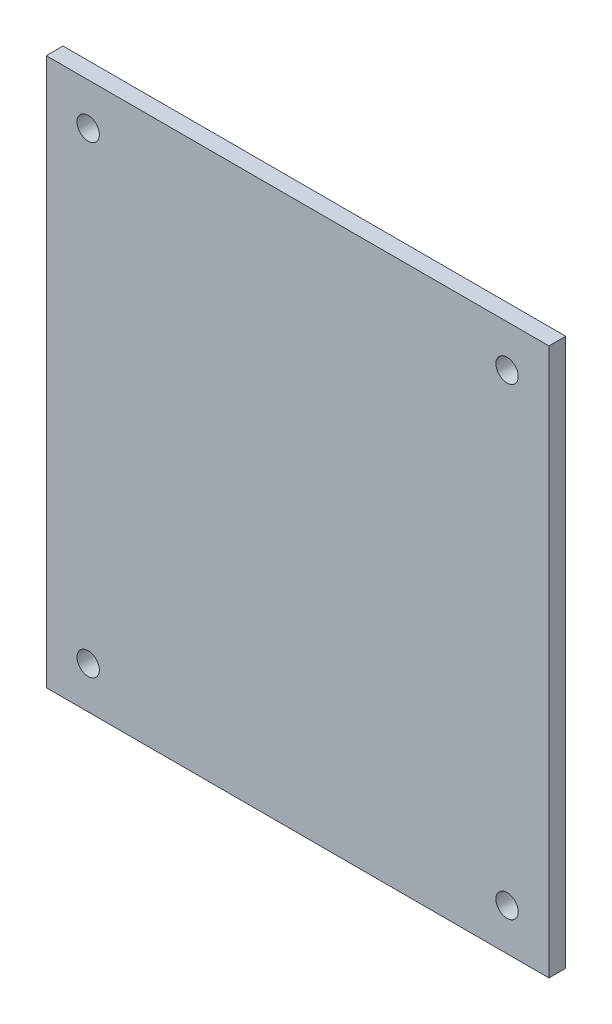
ISO-10303-21;
HEADER;
FILE_DESCRIPTION(('STEP AP214'),'2;1');
FILE_NAME('part.step','',(''),(''),'','','');
FILE_SCHEMA(('AUTOMOTIVE_DESIGN { 1 0 10303 214 1 1 1 1 }'));
ENDSEC;
DATA;
#1=APPLICATION_CONTEXT('core data for automotive mechanical design processes');
#2=APPLICATION_PROTOCOL_DEFINITION('international standard','automotive_design',2000,#1);
#3=PRODUCT_CONTEXT('',#1,'mechanical');
#4=PRODUCT('Part','Part','',(#3));
#5=PRODUCT_RELATED_PRODUCT_CATEGORY('part','',(#4));
#6=PRODUCT_DEFINITION_FORMATION('','',#4);
#7=PRODUCT_DEFINITION_CONTEXT('part definition',#1,'design');
#8=PRODUCT_DEFINITION('design','',#6,#7);
#9=PRODUCT_DEFINITION_SHAPE('','',#8);
#10=(LENGTH_UNIT() NAMED_UNIT(*) SI_UNIT(.MILLI.,.METRE.));
#11=(NAMED_UNIT(*) PLANE_ANGLE_UNIT() SI_UNIT($,.RADIAN.));
#12=(NAMED_UNIT(*) SI_UNIT($,.STERADIAN.) SOLID_ANGLE_UNIT());
#13=UNCERTAINTY_MEASURE_WITH_UNIT(LENGTH_MEASURE(1.E-05),#10,'distance_accuracy_value','');
#14=(GEOMETRIC_REPRESENTATION_CONTEXT(3) GLOBAL_UNCERTAINTY_ASSIGNED_CONTEXT((#13)) GLOBAL_UNIT_ASSIGNED_CONTEXT((#10,
#11,#12)) REPRESENTATION_CONTEXT('',''));
#15=CARTESIAN_POINT('',(0.,0.,0.));
#16=DIRECTION('',(0.,0.,1.));
#17=DIRECTION('',(1.,0.,0.));
#18=AXIS2_PLACEMENT_3D('',#15,#16,#17);
#19=CARTESIAN_POINT('',(-22.5,24.5,1.5));
#20=DIRECTION('',(1.,0.,0.));
#21=DIRECTION('',(0.,1.,0.));
#22=AXIS2_PLACEMENT_3D('',#19,#20,#21);
#23=PLANE('',#22);
#24=DIRECTION('',(0.,-1.,0.));
#25=VECTOR('',#24,1.);
#26=CARTESIAN_POINT('',(-22.5,24.5,0.));
#27=LINE('',#26,#25);
#28=CARTESIAN_POINT('',(-22.5,24.5,0.));
#29=VERTEX_POINT('',#28);
#30=CARTESIAN_POINT('',(-22.5,-24.5,0.));
#31=VERTEX_POINT('',#30);
#32=EDGE_CURVE('E112',#29,#31,#27,.T.);
#33=ORIENTED_EDGE('',*,*,#32,.T.);
#34=DIRECTION('',(0.,0.,-1.));
#35=VECTOR('',#34,1.);
#36=CARTESIAN_POINT('',(-22.5,-24.5,1.5));
#37=LINE('',#36,#35);
#38=CARTESIAN_POINT('',(-22.5,-24.5,1.5));
#39=VERTEX_POINT('',#38);
#40=EDGE_CURVE('E11',#39,#31,#37,.T.);
#41=ORIENTED_EDGE('',*,*,#40,.F.);
#42=DIRECTION('',(0.,-1.,0.));
#43=VECTOR('',#42,1.);
#44=CARTESIAN_POINT('',(-22.5,24.5,1.5));
#45=LINE('',#44,#43);
#46=CARTESIAN_POINT('',(-22.5,24.5,1.5));
#47=VERTEX_POINT('',#46);
#48=EDGE_CURVE('E96',#47,#39,#45,.T.);
#49=ORIENTED_EDGE('',*,*,#48,.F.);
#50=DIRECTION('',(0.,0.,-1.));
#51=VECTOR('',#50,1.);
#52=CARTESIAN_POINT('',(-22.5,24.5,1.5));
#53=LINE('',#52,#51);
#54=EDGE_CURVE('E108',#47,#29,#53,.T.);
#55=ORIENTED_EDGE('',*,*,#54,.T.);
#56=EDGE_LOOP('',(#33,#41,#49,#55));
#57=FACE_BOUND('',#56,.T.);
#58=ADVANCED_FACE('F44',(#57),#23,.F.);
#59=CARTESIAN_POINT('',(22.5,-24.5,1.5));
#60=DIRECTION('',(0.,1.,0.));
#61=DIRECTION('',(-1.,0.,0.));
#62=AXIS2_PLACEMENT_3D('',#59,#60,#61);
#63=PLANE('',#62);
#64=DIRECTION('',(1.,0.,0.));
#65=VECTOR('',#64,1.);
#66=CARTESIAN_POINT('',(22.5,-24.5,0.));
#67=LINE('',#66,#65);
#68=CARTESIAN_POINT('',(22.5,-24.5,0.));
#69=VERTEX_POINT('',#68);
#70=EDGE_CURVE('E101',#31,#69,#67,.T.);
#71=ORIENTED_EDGE('',*,*,#70,.T.);
#72=DIRECTION('',(0.,0.,-1.));
#73=VECTOR('',#72,1.);
#74=CARTESIAN_POINT('',(22.5,-24.5,1.5));
#75=LINE('',#74,#73);
#76=CARTESIAN_POINT('',(22.5,-24.5,1.5));
#77=VERTEX_POINT('',#76);
#78=EDGE_CURVE('E53',#77,#69,#75,.T.);
#79=ORIENTED_EDGE('',*,*,#78,.F.);
#80=DIRECTION('',(1.,0.,0.));
#81=VECTOR('',#80,1.);
#82=CARTESIAN_POINT('',(22.5,-24.5,1.5));
#83=LINE('',#82,#81);
#84=EDGE_CURVE('E91',#39,#77,#83,.T.);
#85=ORIENTED_EDGE('',*,*,#84,.F.);
#86=ORIENTED_EDGE('',*,*,#40,.T.);
#87=EDGE_LOOP('',(#71,#79,#85,#86));
#88=FACE_BOUND('',#87,.T.);
#89=ADVANCED_FACE('F100',(#88),#63,.F.);
#90=CARTESIAN_POINT('',(22.5,24.5,1.5));
#91=DIRECTION('',(-1.,0.,0.));
#92=DIRECTION('',(0.,-1.,0.));
#93=AXIS2_PLACEMENT_3D('',#90,#91,#92);
#94=PLANE('',#93);
#95=DIRECTION('',(0.,1.,0.));
#96=VECTOR('',#95,1.);
#97=CARTESIAN_POINT('',(22.5,24.5,0.));
#98=LINE('',#97,#96);
#99=CARTESIAN_POINT('',(22.5,24.5,0.));
#100=VERTEX_POINT('',#99);
#101=EDGE_CURVE('E78',#69,#100,#98,.T.);
#102=ORIENTED_EDGE('',*,*,#101,.T.);
#103=DIRECTION('',(0.,0.,-1.));
#104=VECTOR('',#103,1.);
#105=CARTESIAN_POINT('',(22.5,24.5,1.5));
#106=LINE('',#105,#104);
#107=CARTESIAN_POINT('',(22.5,24.5,1.5));
#108=VERTEX_POINT('',#107);
#109=EDGE_CURVE('E103',#108,#100,#106,.T.);
#110=ORIENTED_EDGE('',*,*,#109,.F.);
#111=DIRECTION('',(0.,1.,0.));
#112=VECTOR('',#111,1.);
#113=CARTESIAN_POINT('',(22.5,24.5,1.5));
#114=LINE('',#113,#112);
#115=EDGE_CURVE('E94',#77,#108,#114,.T.);
#116=ORIENTED_EDGE('',*,*,#115,.F.);
#117=ORIENTED_EDGE('',*,*,#78,.T.);
#118=EDGE_LOOP('',(#102,#110,#116,#117));
#119=FACE_BOUND('',#118,.T.);
#120=ADVANCED_FACE('F104',(#119),#94,.F.);
#121=CARTESIAN_POINT('',(22.5,24.5,1.5));
#122=DIRECTION('',(0.,-1.,0.));
#123=DIRECTION('',(1.,0.,0.));
#124=AXIS2_PLACEMENT_3D('',#121,#122,#123);
#125=PLANE('',#124);
#126=DIRECTION('',(-1.,0.,0.));
#127=VECTOR('',#126,1.);
#128=CARTESIAN_POINT('',(22.5,24.5,0.));
#129=LINE('',#128,#127);
#130=EDGE_CURVE('E84',#100,#29,#129,.T.);
#131=ORIENTED_EDGE('',*,*,#130,.T.);
#132=ORIENTED_EDGE('',*,*,#54,.F.);
#133=DIRECTION('',(-1.,0.,0.));
#134=VECTOR('',#133,1.);
#135=CARTESIAN_POINT('',(22.5,24.5,1.5));
#136=LINE('',#135,#134);
#137=EDGE_CURVE('E61',#108,#47,#136,.T.);
#138=ORIENTED_EDGE('',*,*,#137,.F.);
#139=ORIENTED_EDGE('',*,*,#109,.T.);
#140=EDGE_LOOP('',(#131,#132,#138,#139));
#141=FACE_BOUND('',#140,.T.);
#142=ADVANCED_FACE('F126',(#141),#125,.F.);
#143=CARTESIAN_POINT('',(0.,0.,1.5));
#144=DIRECTION('',(0.,0.,-1.));
#145=DIRECTION('',(-1.,0.,0.));
#146=AXIS2_PLACEMENT_3D('',#143,#144,#145);
#147=PLANE('',#146);
#148=CARTESIAN_POINT('',(-18.75,-20.75,1.5));
#149=DIRECTION('',(0.,0.,-1.));
#150=DIRECTION('',(-1.,0.,0.));
#151=AXIS2_PLACEMENT_3D('',#148,#149,#150);
#152=CIRCLE('',#151,1.);
#153=CARTESIAN_POINT('',(-19.75,-20.75,1.5));
#154=VERTEX_POINT('',#153);
#155=EDGE_CURVE('E116',#154,#154,#152,.T.);
#156=ORIENTED_EDGE('',*,*,#155,.T.);
#157=EDGE_LOOP('',(#156));
#158=FACE_BOUND('',#157,.T.);
#159=CARTESIAN_POINT('',(18.75,-20.75,1.5));
#160=DIRECTION('',(0.,0.,-1.));
#161=DIRECTION('',(-1.,0.,0.));
#162=AXIS2_PLACEMENT_3D('',#159,#160,#161);
#163=CIRCLE('',#162,1.);
#164=CARTESIAN_POINT('',(17.75,-20.75,1.5));
#165=VERTEX_POINT('',#164);
#166=EDGE_CURVE('E136',#165,#165,#163,.T.);
#167=ORIENTED_EDGE('',*,*,#166,.T.);
#168=EDGE_LOOP('',(#167));
#169=FACE_BOUND('',#168,.T.);
#170=CARTESIAN_POINT('',(18.75,20.75,1.5));
#171=DIRECTION('',(0.,0.,-1.));
#172=DIRECTION('',(-1.,0.,0.));
#173=AXIS2_PLACEMENT_3D('',#170,#171,#172);
#174=CIRCLE('',#173,1.);
#175=CARTESIAN_POINT('',(17.75,20.75,1.5));
#176=VERTEX_POINT('',#175);
#177=EDGE_CURVE('E140',#176,#176,#174,.T.);
#178=ORIENTED_EDGE('',*,*,#177,.T.);
#179=EDGE_LOOP('',(#178));
#180=FACE_BOUND('',#179,.T.);
#181=CARTESIAN_POINT('',(-18.75,20.75,1.5));
#182=DIRECTION('',(0.,0.,-1.));
#183=DIRECTION('',(-1.,0.,0.));
#184=AXIS2_PLACEMENT_3D('',#181,#182,#183);
#185=CIRCLE('',#184,1.);
#186=CARTESIAN_POINT('',(-19.75,20.75,1.5));
#187=VERTEX_POINT('',#186);
#188=EDGE_CURVE('E144',#187,#187,#185,.T.);
#189=ORIENTED_EDGE('',*,*,#188,.T.);
#190=EDGE_LOOP('',(#189));
#191=FACE_BOUND('',#190,.T.);
#192=ORIENTED_EDGE('',*,*,#48,.T.);
#193=ORIENTED_EDGE('',*,*,#84,.T.);
#194=ORIENTED_EDGE('',*,*,#115,.T.);
#195=ORIENTED_EDGE('',*,*,#137,.T.);
#196=EDGE_LOOP('',(#192,#193,#194,#195));
#197=FACE_BOUND('',#196,.T.);
#198=ADVANCED_FACE('F92',(#158,#169,#180,#191,#197),#147,.F.);
#199=CARTESIAN_POINT('',(0.,0.,0.));
#200=DIRECTION('',(0.,0.,-1.));
#201=DIRECTION('',(-1.,0.,0.));
#202=AXIS2_PLACEMENT_3D('',#199,#200,#201);
#203=PLANE('',#202);
#204=CARTESIAN_POINT('',(-18.75,-20.75,0.));
#205=DIRECTION('',(0.,0.,1.));
#206=DIRECTION('',(-1.,0.,0.));
#207=AXIS2_PLACEMENT_3D('',#204,#205,#206);
#208=CIRCLE('',#207,1.);
#209=CARTESIAN_POINT('',(-19.75,-20.75,0.));
#210=VERTEX_POINT('',#209);
#211=EDGE_CURVE('E153',#210,#210,#208,.T.);
#212=ORIENTED_EDGE('',*,*,#211,.T.);
#213=EDGE_LOOP('',(#212));
#214=FACE_BOUND('',#213,.T.);
#215=CARTESIAN_POINT('',(18.75,-20.75,0.));
#216=DIRECTION('',(0.,0.,1.));
#217=DIRECTION('',(1.,0.,0.));
#218=AXIS2_PLACEMENT_3D('',#215,#216,#217);
#219=CIRCLE('',#218,1.);
#220=CARTESIAN_POINT('',(19.75,-20.75,0.));
#221=VERTEX_POINT('',#220);
#222=EDGE_CURVE('E157',#221,#221,#219,.T.);
#223=ORIENTED_EDGE('',*,*,#222,.T.);
#224=EDGE_LOOP('',(#223));
#225=FACE_BOUND('',#224,.T.);
#226=CARTESIAN_POINT('',(18.75,20.75,0.));
#227=DIRECTION('',(0.,0.,1.));
#228=DIRECTION('',(-1.,0.,0.));
#229=AXIS2_PLACEMENT_3D('',#226,#227,#228);
#230=CIRCLE('',#229,1.);
#231=CARTESIAN_POINT('',(17.75,20.75,0.));
#232=VERTEX_POINT('',#231);
#233=EDGE_CURVE('E152',#232,#232,#230,.T.);
#234=ORIENTED_EDGE('',*,*,#233,.T.);
#235=EDGE_LOOP('',(#234));
#236=FACE_BOUND('',#235,.T.);
#237=CARTESIAN_POINT('',(-18.75,20.75,0.));
#238=DIRECTION('',(0.,0.,1.));
#239=DIRECTION('',(1.,0.,0.));
#240=AXIS2_PLACEMENT_3D('',#237,#238,#239);
#241=CIRCLE('',#240,1.);
#242=CARTESIAN_POINT('',(-17.75,20.75,0.));
#243=VERTEX_POINT('',#242);
#244=EDGE_CURVE('E148',#243,#243,#241,.T.);
#245=ORIENTED_EDGE('',*,*,#244,.T.);
#246=EDGE_LOOP('',(#245));
#247=FACE_BOUND('',#246,.T.);
#248=ORIENTED_EDGE('',*,*,#32,.F.);
#249=ORIENTED_EDGE('',*,*,#130,.F.);
#250=ORIENTED_EDGE('',*,*,#101,.F.);
#251=ORIENTED_EDGE('',*,*,#70,.F.);
#252=EDGE_LOOP('',(#248,#249,#250,#251));
#253=FACE_BOUND('',#252,.T.);
#254=ADVANCED_FACE('F129',(#214,#225,#236,#247,#253),#203,.T.);
#255=CARTESIAN_POINT('',(-18.75,20.75,0.));
#256=DIRECTION('',(0.,0.,1.));
#257=DIRECTION('',(1.,0.,0.));
#258=AXIS2_PLACEMENT_3D('',#255,#256,#257);
#259=CYLINDRICAL_SURFACE('',#258,1.);
#260=ORIENTED_EDGE('',*,*,#244,.F.);
#261=EDGE_LOOP('',(#260));
#262=FACE_BOUND('',#261,.T.);
#263=ORIENTED_EDGE('',*,*,#188,.F.);
#264=EDGE_LOOP('',(#263));
#265=FACE_BOUND('',#264,.T.);
#266=ADVANCED_FACE('F171',(#262,#265),#259,.F.);
#267=CARTESIAN_POINT('',(18.75,20.75,0.));
#268=DIRECTION('',(0.,0.,1.));
#269=DIRECTION('',(1.,0.,0.));
#270=AXIS2_PLACEMENT_3D('',#267,#268,#269);
#271=CYLINDRICAL_SURFACE('',#270,1.);
#272=ORIENTED_EDGE('',*,*,#233,.F.);
#273=EDGE_LOOP('',(#272));
#274=FACE_BOUND('',#273,.T.);
#275=ORIENTED_EDGE('',*,*,#177,.F.);
#276=EDGE_LOOP('',(#275));
#277=FACE_BOUND('',#276,.T.);
#278=ADVANCED_FACE('F167',(#274,#277),#271,.F.);
#279=CARTESIAN_POINT('',(18.75,-20.75,0.));
#280=DIRECTION('',(0.,0.,1.));
#281=DIRECTION('',(1.,0.,0.));
#282=AXIS2_PLACEMENT_3D('',#279,#280,#281);
#283=CYLINDRICAL_SURFACE('',#282,1.);
#284=ORIENTED_EDGE('',*,*,#222,.F.);
#285=EDGE_LOOP('',(#284));
#286=FACE_BOUND('',#285,.T.);
#287=ORIENTED_EDGE('',*,*,#166,.F.);
#288=EDGE_LOOP('',(#287));
#289=FACE_BOUND('',#288,.T.);
#290=ADVANCED_FACE('F170',(#286,#289),#283,.F.);
#291=CARTESIAN_POINT('',(-18.75,-20.75,0.));
#292=DIRECTION('',(0.,0.,1.));
#293=DIRECTION('',(1.,0.,0.));
#294=AXIS2_PLACEMENT_3D('',#291,#292,#293);
#295=CYLINDRICAL_SURFACE('',#294,1.);
#296=ORIENTED_EDGE('',*,*,#211,.F.);
#297=EDGE_LOOP('',(#296));
#298=FACE_BOUND('',#297,.T.);
#299=ORIENTED_EDGE('',*,*,#155,.F.);
#300=EDGE_LOOP('',(#299));
#301=FACE_BOUND('',#300,.T.);
#302=ADVANCED_FACE('F235',(#298,#301),#295,.F.);
#303=CLOSED_SHELL('',(#58,#89,#120,#142,#198,#254,#266,#278,#290,#302));
#304=MANIFOLD_SOLID_BREP('B2',#303);
#305=ADVANCED_BREP_SHAPE_REPRESENTATION('',(#18,#304),#14);
#306=SHAPE_DEFINITION_REPRESENTATION(#9,#305);
ENDSEC;
END-ISO-10303-21;
